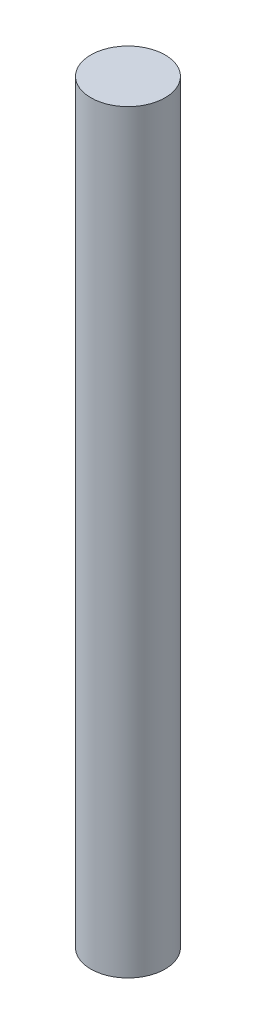
ISO-10303-21;
HEADER;
FILE_DESCRIPTION(('STEP AP214'),'2;1');
FILE_NAME('part.step','',(''),(''),'','','');
FILE_SCHEMA(('AUTOMOTIVE_DESIGN { 1 0 10303 214 1 1 1 1 }'));
ENDSEC;
DATA;
#1=APPLICATION_CONTEXT('core data for automotive mechanical design processes');
#2=APPLICATION_PROTOCOL_DEFINITION('international standard','automotive_design',2000,#1);
#3=PRODUCT_CONTEXT('',#1,'mechanical');
#4=PRODUCT('Part','Part','',(#3));
#5=PRODUCT_RELATED_PRODUCT_CATEGORY('part','',(#4));
#6=PRODUCT_DEFINITION_FORMATION('','',#4);
#7=PRODUCT_DEFINITION_CONTEXT('part definition',#1,'design');
#8=PRODUCT_DEFINITION('design','',#6,#7);
#9=PRODUCT_DEFINITION_SHAPE('','',#8);
#10=(LENGTH_UNIT() NAMED_UNIT(*) SI_UNIT(.MILLI.,.METRE.));
#11=(NAMED_UNIT(*) PLANE_ANGLE_UNIT() SI_UNIT($,.RADIAN.));
#12=(NAMED_UNIT(*) SI_UNIT($,.STERADIAN.) SOLID_ANGLE_UNIT());
#13=UNCERTAINTY_MEASURE_WITH_UNIT(LENGTH_MEASURE(1.E-05),#10,'distance_accuracy_value','');
#14=(GEOMETRIC_REPRESENTATION_CONTEXT(3) GLOBAL_UNCERTAINTY_ASSIGNED_CONTEXT((#13)) GLOBAL_UNIT_ASSIGNED_CONTEXT((#10,
#11,#12)) REPRESENTATION_CONTEXT('',''));
#15=CARTESIAN_POINT('',(0.,0.,0.));
#16=DIRECTION('',(0.,0.,1.));
#17=DIRECTION('',(1.,0.,0.));
#18=AXIS2_PLACEMENT_3D('',#15,#16,#17);
#19=CARTESIAN_POINT('',(0.,50.8,0.));
#20=DIRECTION('',(0.,-1.,0.));
#21=DIRECTION('',(0.,0.,-1.));
#22=AXIS2_PLACEMENT_3D('',#19,#20,#21);
#23=CYLINDRICAL_SURFACE('',#22,2.5);
#24=CARTESIAN_POINT('',(0.,50.8,0.));
#25=DIRECTION('',(0.,1.,0.));
#26=DIRECTION('',(0.,0.,1.));
#27=AXIS2_PLACEMENT_3D('',#24,#25,#26);
#28=CIRCLE('',#27,2.5);
#29=CARTESIAN_POINT('',(0.,50.8,2.5));
#30=VERTEX_POINT('',#29);
#31=EDGE_CURVE('E10',#30,#30,#28,.T.);
#32=ORIENTED_EDGE('',*,*,#31,.F.);
#33=EDGE_LOOP('',(#32));
#34=FACE_BOUND('',#33,.T.);
#35=CARTESIAN_POINT('',(0.,0.,0.));
#36=DIRECTION('',(0.,1.,0.));
#37=DIRECTION('',(0.,0.,1.));
#38=AXIS2_PLACEMENT_3D('',#35,#36,#37);
#39=CIRCLE('',#38,2.5);
#40=CARTESIAN_POINT('',(0.,0.,2.5));
#41=VERTEX_POINT('',#40);
#42=EDGE_CURVE('E33',#41,#41,#39,.T.);
#43=ORIENTED_EDGE('',*,*,#42,.T.);
#44=EDGE_LOOP('',(#43));
#45=FACE_BOUND('',#44,.T.);
#46=ADVANCED_FACE('F30',(#34,#45),#23,.T.);
#47=CARTESIAN_POINT('',(0.,50.8,0.));
#48=DIRECTION('',(0.,1.,0.));
#49=DIRECTION('',(0.,0.,1.));
#50=AXIS2_PLACEMENT_3D('',#47,#48,#49);
#51=PLANE('',#50);
#52=ORIENTED_EDGE('',*,*,#31,.T.);
#53=EDGE_LOOP('',(#52));
#54=FACE_BOUND('',#53,.T.);
#55=ADVANCED_FACE('F45',(#54),#51,.T.);
#56=CARTESIAN_POINT('',(0.,0.,0.));
#57=DIRECTION('',(0.,1.,0.));
#58=DIRECTION('',(0.,0.,1.));
#59=AXIS2_PLACEMENT_3D('',#56,#57,#58);
#60=PLANE('',#59);
#61=ORIENTED_EDGE('',*,*,#42,.F.);
#62=EDGE_LOOP('',(#61));
#63=FACE_BOUND('',#62,.T.);
#64=ADVANCED_FACE('F43',(#63),#60,.F.);
#65=CLOSED_SHELL('',(#46,#55,#64));
#66=MANIFOLD_SOLID_BREP('B2',#65);
#67=ADVANCED_BREP_SHAPE_REPRESENTATION('',(#18,#66),#14);
#68=SHAPE_DEFINITION_REPRESENTATION(#9,#67);
ENDSEC;
END-ISO-10303-21;
